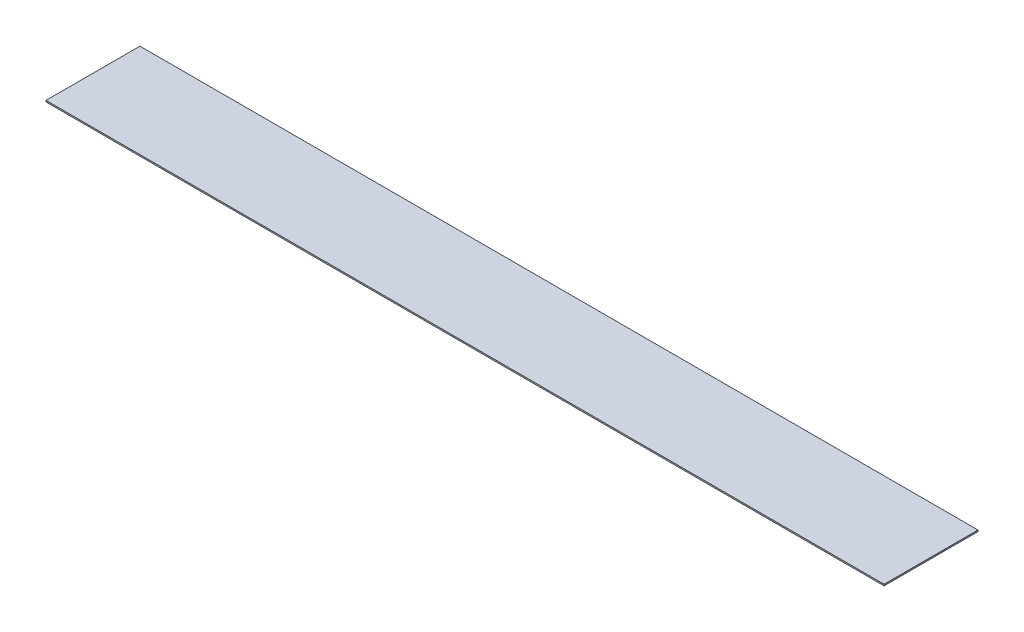
ISO-10303-21;
HEADER;
FILE_DESCRIPTION(('STEP AP214'),'2;1');
FILE_NAME('part.step','',(''),(''),'','','');
FILE_SCHEMA(('AUTOMOTIVE_DESIGN { 1 0 10303 214 1 1 1 1 }'));
ENDSEC;
DATA;
#1=APPLICATION_CONTEXT('core data for automotive mechanical design processes');
#2=APPLICATION_PROTOCOL_DEFINITION('international standard','automotive_design',2000,#1);
#3=PRODUCT_CONTEXT('',#1,'mechanical');
#4=PRODUCT('Part','Part','',(#3));
#5=PRODUCT_RELATED_PRODUCT_CATEGORY('part','',(#4));
#6=PRODUCT_DEFINITION_FORMATION('','',#4);
#7=PRODUCT_DEFINITION_CONTEXT('part definition',#1,'design');
#8=PRODUCT_DEFINITION('design','',#6,#7);
#9=PRODUCT_DEFINITION_SHAPE('','',#8);
#10=(LENGTH_UNIT() NAMED_UNIT(*) SI_UNIT(.MILLI.,.METRE.));
#11=(NAMED_UNIT(*) PLANE_ANGLE_UNIT() SI_UNIT($,.RADIAN.));
#12=(NAMED_UNIT(*) SI_UNIT($,.STERADIAN.) SOLID_ANGLE_UNIT());
#13=UNCERTAINTY_MEASURE_WITH_UNIT(LENGTH_MEASURE(1.E-05),#10,'distance_accuracy_value','');
#14=(GEOMETRIC_REPRESENTATION_CONTEXT(3) GLOBAL_UNCERTAINTY_ASSIGNED_CONTEXT((#13)) GLOBAL_UNIT_ASSIGNED_CONTEXT((#10,
#11,#12)) REPRESENTATION_CONTEXT('',''));
#15=CARTESIAN_POINT('',(0.,0.,0.));
#16=DIRECTION('',(0.,0.,1.));
#17=DIRECTION('',(1.,0.,0.));
#18=AXIS2_PLACEMENT_3D('',#15,#16,#17);
#19=CARTESIAN_POINT('',(0.,3.,0.));
#20=DIRECTION('',(1.,0.,0.));
#21=DIRECTION('',(0.,0.,-1.));
#22=AXIS2_PLACEMENT_3D('',#19,#20,#21);
#23=PLANE('',#22);
#24=DIRECTION('',(0.,0.,1.));
#25=VECTOR('',#24,1.);
#26=CARTESIAN_POINT('',(0.,0.,0.));
#27=LINE('',#26,#25);
#28=CARTESIAN_POINT('',(0.,0.,-200.));
#29=VERTEX_POINT('',#28);
#30=CARTESIAN_POINT('',(0.,0.,0.));
#31=VERTEX_POINT('',#30);
#32=EDGE_CURVE('E96',#29,#31,#27,.T.);
#33=ORIENTED_EDGE('',*,*,#32,.T.);
#34=DIRECTION('',(0.,-1.,0.));
#35=VECTOR('',#34,1.);
#36=CARTESIAN_POINT('',(0.,3.,0.));
#37=LINE('',#36,#35);
#38=CARTESIAN_POINT('',(0.,3.,0.));
#39=VERTEX_POINT('',#38);
#40=EDGE_CURVE('E11',#39,#31,#37,.T.);
#41=ORIENTED_EDGE('',*,*,#40,.F.);
#42=DIRECTION('',(0.,0.,1.));
#43=VECTOR('',#42,1.);
#44=CARTESIAN_POINT('',(0.,3.,0.));
#45=LINE('',#44,#43);
#46=CARTESIAN_POINT('',(0.,3.,-200.));
#47=VERTEX_POINT('',#46);
#48=EDGE_CURVE('E84',#47,#39,#45,.T.);
#49=ORIENTED_EDGE('',*,*,#48,.F.);
#50=DIRECTION('',(0.,-1.,0.));
#51=VECTOR('',#50,1.);
#52=CARTESIAN_POINT('',(0.,3.,-200.));
#53=LINE('',#52,#51);
#54=EDGE_CURVE('E92',#47,#29,#53,.T.);
#55=ORIENTED_EDGE('',*,*,#54,.T.);
#56=EDGE_LOOP('',(#33,#41,#49,#55));
#57=FACE_BOUND('',#56,.T.);
#58=ADVANCED_FACE('F33',(#57),#23,.F.);
#59=CARTESIAN_POINT('',(0.,3.,0.));
#60=DIRECTION('',(0.,0.,-1.));
#61=DIRECTION('',(-1.,0.,0.));
#62=AXIS2_PLACEMENT_3D('',#59,#60,#61);
#63=PLANE('',#62);
#64=DIRECTION('',(1.,0.,0.));
#65=VECTOR('',#64,1.);
#66=CARTESIAN_POINT('',(0.,0.,0.));
#67=LINE('',#66,#65);
#68=CARTESIAN_POINT('',(1785.,0.,0.));
#69=VERTEX_POINT('',#68);
#70=EDGE_CURVE('E88',#31,#69,#67,.T.);
#71=ORIENTED_EDGE('',*,*,#70,.T.);
#72=DIRECTION('',(0.,-1.,0.));
#73=VECTOR('',#72,1.);
#74=CARTESIAN_POINT('',(1785.,3.,0.));
#75=LINE('',#74,#73);
#76=CARTESIAN_POINT('',(1785.,3.,0.));
#77=VERTEX_POINT('',#76);
#78=EDGE_CURVE('E41',#77,#69,#75,.T.);
#79=ORIENTED_EDGE('',*,*,#78,.F.);
#80=DIRECTION('',(1.,0.,0.));
#81=VECTOR('',#80,1.);
#82=CARTESIAN_POINT('',(0.,3.,0.));
#83=LINE('',#82,#81);
#84=EDGE_CURVE('E79',#39,#77,#83,.T.);
#85=ORIENTED_EDGE('',*,*,#84,.F.);
#86=ORIENTED_EDGE('',*,*,#40,.T.);
#87=EDGE_LOOP('',(#71,#79,#85,#86));
#88=FACE_BOUND('',#87,.T.);
#89=ADVANCED_FACE('F87',(#88),#63,.F.);
#90=CARTESIAN_POINT('',(1785.,3.,0.));
#91=DIRECTION('',(-1.,0.,0.));
#92=DIRECTION('',(0.,0.,1.));
#93=AXIS2_PLACEMENT_3D('',#90,#91,#92);
#94=PLANE('',#93);
#95=DIRECTION('',(0.,0.,-1.));
#96=VECTOR('',#95,1.);
#97=CARTESIAN_POINT('',(1785.,0.,0.));
#98=LINE('',#97,#96);
#99=CARTESIAN_POINT('',(1785.,0.,-200.));
#100=VERTEX_POINT('',#99);
#101=EDGE_CURVE('E66',#69,#100,#98,.T.);
#102=ORIENTED_EDGE('',*,*,#101,.T.);
#103=DIRECTION('',(0.,-1.,0.));
#104=VECTOR('',#103,1.);
#105=CARTESIAN_POINT('',(1785.,3.,-200.));
#106=LINE('',#105,#104);
#107=CARTESIAN_POINT('',(1785.,3.,-200.));
#108=VERTEX_POINT('',#107);
#109=EDGE_CURVE('E89',#108,#100,#106,.T.);
#110=ORIENTED_EDGE('',*,*,#109,.F.);
#111=DIRECTION('',(0.,0.,-1.));
#112=VECTOR('',#111,1.);
#113=CARTESIAN_POINT('',(1785.,3.,0.));
#114=LINE('',#113,#112);
#115=EDGE_CURVE('E82',#77,#108,#114,.T.);
#116=ORIENTED_EDGE('',*,*,#115,.F.);
#117=ORIENTED_EDGE('',*,*,#78,.T.);
#118=EDGE_LOOP('',(#102,#110,#116,#117));
#119=FACE_BOUND('',#118,.T.);
#120=ADVANCED_FACE('F90',(#119),#94,.F.);
#121=CARTESIAN_POINT('',(0.,3.,-200.));
#122=DIRECTION('',(0.,0.,1.));
#123=DIRECTION('',(1.,0.,0.));
#124=AXIS2_PLACEMENT_3D('',#121,#122,#123);
#125=PLANE('',#124);
#126=DIRECTION('',(-1.,0.,0.));
#127=VECTOR('',#126,1.);
#128=CARTESIAN_POINT('',(0.,0.,-200.));
#129=LINE('',#128,#127);
#130=EDGE_CURVE('E72',#100,#29,#129,.T.);
#131=ORIENTED_EDGE('',*,*,#130,.T.);
#132=ORIENTED_EDGE('',*,*,#54,.F.);
#133=DIRECTION('',(-1.,0.,0.));
#134=VECTOR('',#133,1.);
#135=CARTESIAN_POINT('',(0.,3.,-200.));
#136=LINE('',#135,#134);
#137=EDGE_CURVE('E49',#108,#47,#136,.T.);
#138=ORIENTED_EDGE('',*,*,#137,.F.);
#139=ORIENTED_EDGE('',*,*,#109,.T.);
#140=EDGE_LOOP('',(#131,#132,#138,#139));
#141=FACE_BOUND('',#140,.T.);
#142=ADVANCED_FACE('F103',(#141),#125,.F.);
#143=CARTESIAN_POINT('',(0.,3.,0.));
#144=DIRECTION('',(0.,-1.,0.));
#145=DIRECTION('',(0.,0.,-1.));
#146=AXIS2_PLACEMENT_3D('',#143,#144,#145);
#147=PLANE('',#146);
#148=ORIENTED_EDGE('',*,*,#48,.T.);
#149=ORIENTED_EDGE('',*,*,#84,.T.);
#150=ORIENTED_EDGE('',*,*,#115,.T.);
#151=ORIENTED_EDGE('',*,*,#137,.T.);
#152=EDGE_LOOP('',(#148,#149,#150,#151));
#153=FACE_BOUND('',#152,.T.);
#154=ADVANCED_FACE('F80',(#153),#147,.F.);
#155=CARTESIAN_POINT('',(0.,0.,0.));
#156=DIRECTION('',(0.,-1.,0.));
#157=DIRECTION('',(0.,0.,-1.));
#158=AXIS2_PLACEMENT_3D('',#155,#156,#157);
#159=PLANE('',#158);
#160=ORIENTED_EDGE('',*,*,#32,.F.);
#161=ORIENTED_EDGE('',*,*,#130,.F.);
#162=ORIENTED_EDGE('',*,*,#101,.F.);
#163=ORIENTED_EDGE('',*,*,#70,.F.);
#164=EDGE_LOOP('',(#160,#161,#162,#163));
#165=FACE_BOUND('',#164,.T.);
#166=ADVANCED_FACE('F106',(#165),#159,.T.);
#167=CLOSED_SHELL('',(#58,#89,#120,#142,#154,#166));
#168=MANIFOLD_SOLID_BREP('B2',#167);
#169=ADVANCED_BREP_SHAPE_REPRESENTATION('',(#18,#168),#14);
#170=SHAPE_DEFINITION_REPRESENTATION(#9,#169);
ENDSEC;
END-ISO-10303-21;
